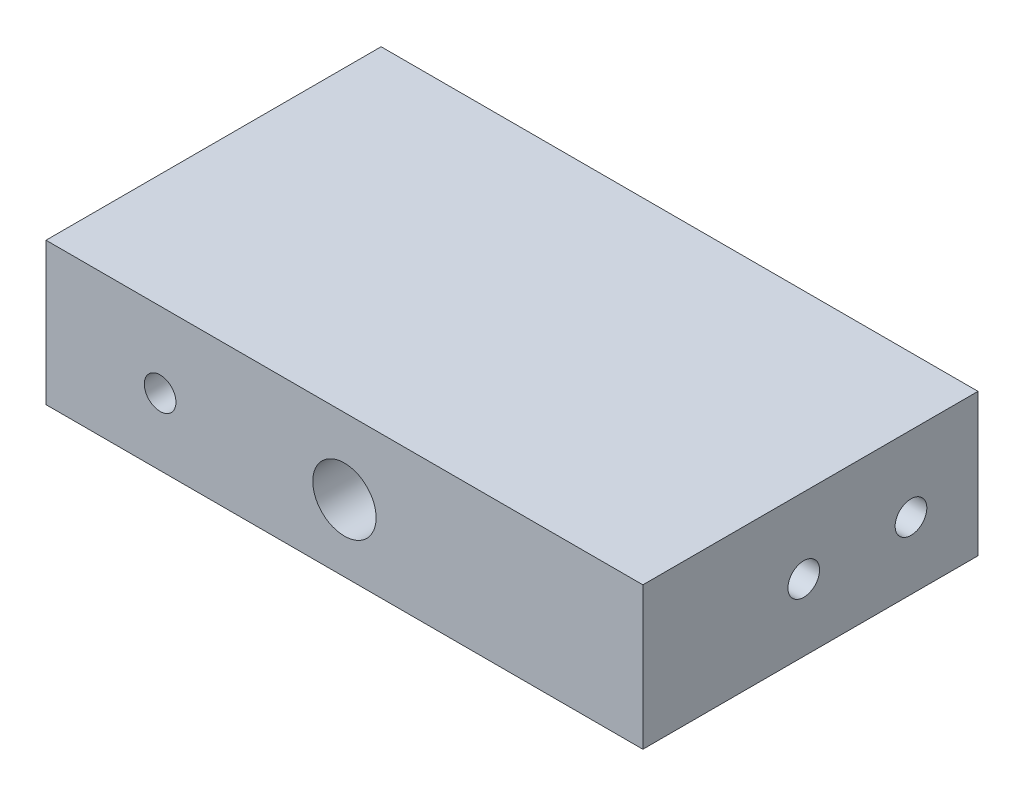
ISO-10303-21;
HEADER;
FILE_DESCRIPTION(('STEP AP214'),'2;1');
FILE_NAME('part.step','',(''),(''),'','','');
FILE_SCHEMA(('AUTOMOTIVE_DESIGN { 1 0 10303 214 1 1 1 1 }'));
ENDSEC;
DATA;
#1=APPLICATION_CONTEXT('core data for automotive mechanical design processes');
#2=APPLICATION_PROTOCOL_DEFINITION('international standard','automotive_design',2000,#1);
#3=PRODUCT_CONTEXT('',#1,'mechanical');
#4=PRODUCT('Part','Part','',(#3));
#5=PRODUCT_RELATED_PRODUCT_CATEGORY('part','',(#4));
#6=PRODUCT_DEFINITION_FORMATION('','',#4);
#7=PRODUCT_DEFINITION_CONTEXT('part definition',#1,'design');
#8=PRODUCT_DEFINITION('design','',#6,#7);
#9=PRODUCT_DEFINITION_SHAPE('','',#8);
#10=(LENGTH_UNIT() NAMED_UNIT(*) SI_UNIT(.MILLI.,.METRE.));
#11=(NAMED_UNIT(*) PLANE_ANGLE_UNIT() SI_UNIT($,.RADIAN.));
#12=(NAMED_UNIT(*) SI_UNIT($,.STERADIAN.) SOLID_ANGLE_UNIT());
#13=UNCERTAINTY_MEASURE_WITH_UNIT(LENGTH_MEASURE(1.E-05),#10,'distance_accuracy_value','');
#14=(GEOMETRIC_REPRESENTATION_CONTEXT(3) GLOBAL_UNCERTAINTY_ASSIGNED_CONTEXT((#13)) GLOBAL_UNIT_ASSIGNED_CONTEXT((#10,
#11,#12)) REPRESENTATION_CONTEXT('',''));
#15=CARTESIAN_POINT('',(0.,0.,0.));
#16=DIRECTION('',(0.,0.,1.));
#17=DIRECTION('',(1.,0.,0.));
#18=AXIS2_PLACEMENT_3D('',#15,#16,#17);
#19=CARTESIAN_POINT('',(-28.275,6.35,31.75));
#20=DIRECTION('',(1.,0.,0.));
#21=DIRECTION('',(0.,0.,-1.));
#22=AXIS2_PLACEMENT_3D('',#19,#20,#21);
#23=PLANE('',#22);
#24=CARTESIAN_POINT('',(-28.275,0.,6.35));
#25=DIRECTION('',(-1.,0.,0.));
#26=DIRECTION('',(0.,0.,1.));
#27=AXIS2_PLACEMENT_3D('',#24,#25,#26);
#28=CIRCLE('',#27,1.5);
#29=CARTESIAN_POINT('',(-28.275,0.,7.85));
#30=VERTEX_POINT('',#29);
#31=EDGE_CURVE('E119',#30,#30,#28,.T.);
#32=ORIENTED_EDGE('',*,*,#31,.F.);
#33=EDGE_LOOP('',(#32));
#34=FACE_BOUND('',#33,.T.);
#35=CARTESIAN_POINT('',(-28.275,0.,16.51));
#36=DIRECTION('',(-1.,0.,0.));
#37=DIRECTION('',(0.,0.,1.));
#38=AXIS2_PLACEMENT_3D('',#35,#36,#37);
#39=CIRCLE('',#38,1.5);
#40=CARTESIAN_POINT('',(-28.275,0.,18.01));
#41=VERTEX_POINT('',#40);
#42=EDGE_CURVE('E114',#41,#41,#39,.T.);
#43=ORIENTED_EDGE('',*,*,#42,.F.);
#44=EDGE_LOOP('',(#43));
#45=FACE_BOUND('',#44,.T.);
#46=DIRECTION('',(0.,-1.,0.));
#47=VECTOR('',#46,1.);
#48=CARTESIAN_POINT('',(-28.275,6.35,0.));
#49=LINE('',#48,#47);
#50=CARTESIAN_POINT('',(-28.275,7.14375,0.));
#51=VERTEX_POINT('',#50);
#52=CARTESIAN_POINT('',(-28.275,-6.35,0.));
#53=VERTEX_POINT('',#52);
#54=EDGE_CURVE('E95',#51,#53,#49,.T.);
#55=ORIENTED_EDGE('',*,*,#54,.T.);
#56=DIRECTION('',(0.,0.,-1.));
#57=VECTOR('',#56,1.);
#58=CARTESIAN_POINT('',(-28.275,-6.35,31.75));
#59=LINE('',#58,#57);
#60=CARTESIAN_POINT('',(-28.275,-6.35,31.75));
#61=VERTEX_POINT('',#60);
#62=EDGE_CURVE('E11',#61,#53,#59,.T.);
#63=ORIENTED_EDGE('',*,*,#62,.F.);
#64=DIRECTION('',(0.,-1.,0.));
#65=VECTOR('',#64,1.);
#66=CARTESIAN_POINT('',(-28.275,6.35,31.75));
#67=LINE('',#66,#65);
#68=CARTESIAN_POINT('',(-28.275,7.14375,31.75));
#69=VERTEX_POINT('',#68);
#70=EDGE_CURVE('E58',#69,#61,#67,.T.);
#71=ORIENTED_EDGE('',*,*,#70,.F.);
#72=DIRECTION('',(0.,0.,1.));
#73=VECTOR('',#72,1.);
#74=CARTESIAN_POINT('',(-28.275,7.14375,0.));
#75=LINE('',#74,#73);
#76=EDGE_CURVE('E99',#51,#69,#75,.T.);
#77=ORIENTED_EDGE('',*,*,#76,.F.);
#78=EDGE_LOOP('',(#55,#63,#71,#77));
#79=FACE_BOUND('',#78,.T.);
#80=ADVANCED_FACE('F41',(#34,#45,#79),#23,.F.);
#81=CARTESIAN_POINT('',(-28.275,-6.35,31.75));
#82=DIRECTION('',(0.,1.,0.));
#83=DIRECTION('',(0.,0.,1.));
#84=AXIS2_PLACEMENT_3D('',#81,#82,#83);
#85=PLANE('',#84);
#86=DIRECTION('',(1.,0.,0.));
#87=VECTOR('',#86,1.);
#88=CARTESIAN_POINT('',(-28.275,-6.35,0.));
#89=LINE('',#88,#87);
#90=CARTESIAN_POINT('',(28.275,-6.35,0.));
#91=VERTEX_POINT('',#90);
#92=EDGE_CURVE('E89',#53,#91,#89,.T.);
#93=ORIENTED_EDGE('',*,*,#92,.T.);
#94=DIRECTION('',(0.,0.,-1.));
#95=VECTOR('',#94,1.);
#96=CARTESIAN_POINT('',(28.275,-6.35,31.75));
#97=LINE('',#96,#95);
#98=CARTESIAN_POINT('',(28.275,-6.35,31.75));
#99=VERTEX_POINT('',#98);
#100=EDGE_CURVE('E45',#99,#91,#97,.T.);
#101=ORIENTED_EDGE('',*,*,#100,.F.);
#102=DIRECTION('',(1.,0.,0.));
#103=VECTOR('',#102,1.);
#104=CARTESIAN_POINT('',(-28.275,-6.35,31.75));
#105=LINE('',#104,#103);
#106=EDGE_CURVE('E138',#61,#99,#105,.T.);
#107=ORIENTED_EDGE('',*,*,#106,.F.);
#108=ORIENTED_EDGE('',*,*,#62,.T.);
#109=EDGE_LOOP('',(#93,#101,#107,#108));
#110=FACE_BOUND('',#109,.T.);
#111=ADVANCED_FACE('F145',(#110),#85,.F.);
#112=CARTESIAN_POINT('',(28.275,6.35,31.75));
#113=DIRECTION('',(1.,0.,0.));
#114=DIRECTION('',(0.,1.,0.));
#115=AXIS2_PLACEMENT_3D('',#112,#113,#114);
#116=PLANE('',#115);
#117=CARTESIAN_POINT('',(28.275,0.,6.35));
#118=DIRECTION('',(-1.,0.,0.));
#119=DIRECTION('',(0.,0.,1.));
#120=AXIS2_PLACEMENT_3D('',#117,#118,#119);
#121=CIRCLE('',#120,1.5);
#122=CARTESIAN_POINT('',(28.275,0.,7.85));
#123=VERTEX_POINT('',#122);
#124=EDGE_CURVE('E106',#123,#123,#121,.T.);
#125=ORIENTED_EDGE('',*,*,#124,.T.);
#126=EDGE_LOOP('',(#125));
#127=FACE_BOUND('',#126,.T.);
#128=CARTESIAN_POINT('',(28.275,0.,16.51));
#129=DIRECTION('',(-1.,0.,0.));
#130=DIRECTION('',(0.,0.,1.));
#131=AXIS2_PLACEMENT_3D('',#128,#129,#130);
#132=CIRCLE('',#131,1.5);
#133=CARTESIAN_POINT('',(28.275,0.,18.01));
#134=VERTEX_POINT('',#133);
#135=EDGE_CURVE('E109',#134,#134,#132,.T.);
#136=ORIENTED_EDGE('',*,*,#135,.T.);
#137=EDGE_LOOP('',(#136));
#138=FACE_BOUND('',#137,.T.);
#139=DIRECTION('',(0.,-1.,0.));
#140=VECTOR('',#139,1.);
#141=CARTESIAN_POINT('',(28.275,6.35,0.));
#142=LINE('',#141,#140);
#143=CARTESIAN_POINT('',(28.275,7.14375,0.));
#144=VERTEX_POINT('',#143);
#145=EDGE_CURVE('E83',#144,#91,#142,.T.);
#146=ORIENTED_EDGE('',*,*,#145,.F.);
#147=DIRECTION('',(0.,0.,-1.));
#148=VECTOR('',#147,1.);
#149=CARTESIAN_POINT('',(28.275,7.14375,31.75));
#150=LINE('',#149,#148);
#151=CARTESIAN_POINT('',(28.275,7.14375,31.75));
#152=VERTEX_POINT('',#151);
#153=EDGE_CURVE('E86',#152,#144,#150,.T.);
#154=ORIENTED_EDGE('',*,*,#153,.F.);
#155=DIRECTION('',(0.,-1.,0.));
#156=VECTOR('',#155,1.);
#157=CARTESIAN_POINT('',(28.275,6.35,31.75));
#158=LINE('',#157,#156);
#159=EDGE_CURVE('E73',#152,#99,#158,.T.);
#160=ORIENTED_EDGE('',*,*,#159,.T.);
#161=ORIENTED_EDGE('',*,*,#100,.T.);
#162=EDGE_LOOP('',(#146,#154,#160,#161));
#163=FACE_BOUND('',#162,.T.);
#164=ADVANCED_FACE('F43',(#127,#138,#163),#116,.T.);
#165=CARTESIAN_POINT('',(0.,0.,31.75));
#166=DIRECTION('',(0.,0.,-1.));
#167=DIRECTION('',(-1.,0.,0.));
#168=AXIS2_PLACEMENT_3D('',#165,#166,#167);
#169=PLANE('',#168);
#170=CARTESIAN_POINT('',(-17.4625,0.,31.75));
#171=DIRECTION('',(0.,0.,1.));
#172=DIRECTION('',(1.,0.,0.));
#173=AXIS2_PLACEMENT_3D('',#170,#171,#172);
#174=CIRCLE('',#173,1.5);
#175=CARTESIAN_POINT('',(-15.9625,0.,31.75));
#176=VERTEX_POINT('',#175);
#177=EDGE_CURVE('E129',#176,#176,#174,.T.);
#178=ORIENTED_EDGE('',*,*,#177,.F.);
#179=EDGE_LOOP('',(#178));
#180=FACE_BOUND('',#179,.T.);
#181=CARTESIAN_POINT('',(0.,0.,31.75));
#182=DIRECTION('',(0.,0.,1.));
#183=DIRECTION('',(1.,0.,0.));
#184=AXIS2_PLACEMENT_3D('',#181,#182,#183);
#185=CIRCLE('',#184,3.);
#186=CARTESIAN_POINT('',(3.,0.,31.75));
#187=VERTEX_POINT('',#186);
#188=EDGE_CURVE('E118',#187,#187,#185,.T.);
#189=ORIENTED_EDGE('',*,*,#188,.F.);
#190=EDGE_LOOP('',(#189));
#191=FACE_BOUND('',#190,.T.);
#192=ORIENTED_EDGE('',*,*,#159,.F.);
#193=DIRECTION('',(1.,0.,0.));
#194=VECTOR('',#193,1.);
#195=CARTESIAN_POINT('',(-28.275,7.14375,31.75));
#196=LINE('',#195,#194);
#197=EDGE_CURVE('E102',#69,#152,#196,.T.);
#198=ORIENTED_EDGE('',*,*,#197,.F.);
#199=ORIENTED_EDGE('',*,*,#70,.T.);
#200=ORIENTED_EDGE('',*,*,#106,.T.);
#201=EDGE_LOOP('',(#192,#198,#199,#200));
#202=FACE_BOUND('',#201,.T.);
#203=ADVANCED_FACE('F146',(#180,#191,#202),#169,.F.);
#204=CARTESIAN_POINT('',(0.,0.,0.));
#205=DIRECTION('',(0.,0.,-1.));
#206=DIRECTION('',(-1.,0.,0.));
#207=AXIS2_PLACEMENT_3D('',#204,#205,#206);
#208=PLANE('',#207);
#209=ORIENTED_EDGE('',*,*,#54,.F.);
#210=DIRECTION('',(-1.,0.,0.));
#211=VECTOR('',#210,1.);
#212=CARTESIAN_POINT('',(28.275,7.14375,0.));
#213=LINE('',#212,#211);
#214=EDGE_CURVE('E93',#144,#51,#213,.T.);
#215=ORIENTED_EDGE('',*,*,#214,.F.);
#216=ORIENTED_EDGE('',*,*,#145,.T.);
#217=ORIENTED_EDGE('',*,*,#92,.F.);
#218=EDGE_LOOP('',(#209,#215,#216,#217));
#219=FACE_BOUND('',#218,.T.);
#220=ADVANCED_FACE('F94',(#219),#208,.T.);
#221=CARTESIAN_POINT('',(0.,0.,21.75));
#222=DIRECTION('',(0.,0.,1.));
#223=DIRECTION('',(1.,0.,0.));
#224=AXIS2_PLACEMENT_3D('',#221,#222,#223);
#225=CYLINDRICAL_SURFACE('',#224,3.);
#226=CARTESIAN_POINT('',(0.,0.,21.75));
#227=DIRECTION('',(0.,0.,1.));
#228=DIRECTION('',(1.,0.,0.));
#229=AXIS2_PLACEMENT_3D('',#226,#227,#228);
#230=CIRCLE('',#229,3.);
#231=CARTESIAN_POINT('',(3.,0.,21.75));
#232=VERTEX_POINT('',#231);
#233=EDGE_CURVE('E132',#232,#232,#230,.T.);
#234=ORIENTED_EDGE('',*,*,#233,.F.);
#235=EDGE_LOOP('',(#234));
#236=FACE_BOUND('',#235,.T.);
#237=ORIENTED_EDGE('',*,*,#188,.T.);
#238=EDGE_LOOP('',(#237));
#239=FACE_BOUND('',#238,.T.);
#240=ADVANCED_FACE('F154',(#236,#239),#225,.F.);
#241=CARTESIAN_POINT('',(0.,0.,21.75));
#242=DIRECTION('',(0.,0.,1.));
#243=DIRECTION('',(1.,0.,0.));
#244=AXIS2_PLACEMENT_3D('',#241,#242,#243);
#245=PLANE('',#244);
#246=ORIENTED_EDGE('',*,*,#233,.T.);
#247=EDGE_LOOP('',(#246));
#248=FACE_BOUND('',#247,.T.);
#249=ADVANCED_FACE('F192',(#248),#245,.T.);
#250=CARTESIAN_POINT('',(-17.4625,0.,21.75));
#251=DIRECTION('',(0.,0.,1.));
#252=DIRECTION('',(1.,0.,0.));
#253=AXIS2_PLACEMENT_3D('',#250,#251,#252);
#254=CYLINDRICAL_SURFACE('',#253,1.5);
#255=CARTESIAN_POINT('',(-17.4625,0.,21.75));
#256=DIRECTION('',(0.,0.,1.));
#257=DIRECTION('',(1.,0.,0.));
#258=AXIS2_PLACEMENT_3D('',#255,#256,#257);
#259=CIRCLE('',#258,1.5);
#260=CARTESIAN_POINT('',(-15.9625,0.,21.75));
#261=VERTEX_POINT('',#260);
#262=EDGE_CURVE('E90',#261,#261,#259,.T.);
#263=ORIENTED_EDGE('',*,*,#262,.F.);
#264=EDGE_LOOP('',(#263));
#265=FACE_BOUND('',#264,.T.);
#266=ORIENTED_EDGE('',*,*,#177,.T.);
#267=EDGE_LOOP('',(#266));
#268=FACE_BOUND('',#267,.T.);
#269=ADVANCED_FACE('F184',(#265,#268),#254,.F.);
#270=CARTESIAN_POINT('',(0.,0.,21.75));
#271=DIRECTION('',(0.,0.,1.));
#272=DIRECTION('',(1.,0.,0.));
#273=AXIS2_PLACEMENT_3D('',#270,#271,#272);
#274=PLANE('',#273);
#275=ORIENTED_EDGE('',*,*,#262,.T.);
#276=EDGE_LOOP('',(#275));
#277=FACE_BOUND('',#276,.T.);
#278=ADVANCED_FACE('F174',(#277),#274,.T.);
#279=CARTESIAN_POINT('',(-20.275,0.,16.51));
#280=DIRECTION('',(-1.,0.,0.));
#281=DIRECTION('',(0.,0.,1.));
#282=AXIS2_PLACEMENT_3D('',#279,#280,#281);
#283=CYLINDRICAL_SURFACE('',#282,1.5);
#284=CARTESIAN_POINT('',(-20.275,0.,16.51));
#285=DIRECTION('',(-1.,0.,0.));
#286=DIRECTION('',(0.,0.,1.));
#287=AXIS2_PLACEMENT_3D('',#284,#285,#286);
#288=CIRCLE('',#287,1.5);
#289=CARTESIAN_POINT('',(-20.275,0.,18.01));
#290=VERTEX_POINT('',#289);
#291=EDGE_CURVE('E122',#290,#290,#288,.T.);
#292=ORIENTED_EDGE('',*,*,#291,.F.);
#293=EDGE_LOOP('',(#292));
#294=FACE_BOUND('',#293,.T.);
#295=ORIENTED_EDGE('',*,*,#42,.T.);
#296=EDGE_LOOP('',(#295));
#297=FACE_BOUND('',#296,.T.);
#298=ADVANCED_FACE('F171',(#294,#297),#283,.F.);
#299=CARTESIAN_POINT('',(-20.275,0.,0.));
#300=DIRECTION('',(-1.,0.,0.));
#301=DIRECTION('',(0.,0.,1.));
#302=AXIS2_PLACEMENT_3D('',#299,#300,#301);
#303=PLANE('',#302);
#304=ORIENTED_EDGE('',*,*,#291,.T.);
#305=EDGE_LOOP('',(#304));
#306=FACE_BOUND('',#305,.T.);
#307=ADVANCED_FACE('F173',(#306),#303,.T.);
#308=CARTESIAN_POINT('',(-20.275,0.,6.35));
#309=DIRECTION('',(-1.,0.,0.));
#310=DIRECTION('',(0.,0.,1.));
#311=AXIS2_PLACEMENT_3D('',#308,#309,#310);
#312=CYLINDRICAL_SURFACE('',#311,1.5);
#313=CARTESIAN_POINT('',(-20.275,0.,6.35));
#314=DIRECTION('',(-1.,0.,0.));
#315=DIRECTION('',(0.,0.,1.));
#316=AXIS2_PLACEMENT_3D('',#313,#314,#315);
#317=CIRCLE('',#316,1.5);
#318=CARTESIAN_POINT('',(-20.275,0.,7.85));
#319=VERTEX_POINT('',#318);
#320=EDGE_CURVE('E115',#319,#319,#317,.T.);
#321=ORIENTED_EDGE('',*,*,#320,.F.);
#322=EDGE_LOOP('',(#321));
#323=FACE_BOUND('',#322,.T.);
#324=ORIENTED_EDGE('',*,*,#31,.T.);
#325=EDGE_LOOP('',(#324));
#326=FACE_BOUND('',#325,.T.);
#327=ADVANCED_FACE('F181',(#323,#326),#312,.F.);
#328=CARTESIAN_POINT('',(-20.275,0.,0.));
#329=DIRECTION('',(-1.,0.,0.));
#330=DIRECTION('',(0.,0.,1.));
#331=AXIS2_PLACEMENT_3D('',#328,#329,#330);
#332=PLANE('',#331);
#333=ORIENTED_EDGE('',*,*,#320,.T.);
#334=EDGE_LOOP('',(#333));
#335=FACE_BOUND('',#334,.T.);
#336=ADVANCED_FACE('F246',(#335),#332,.T.);
#337=CARTESIAN_POINT('',(0.,7.14375,0.));
#338=DIRECTION('',(0.,1.,0.));
#339=DIRECTION('',(0.,0.,1.));
#340=AXIS2_PLACEMENT_3D('',#337,#338,#339);
#341=PLANE('',#340);
#342=ORIENTED_EDGE('',*,*,#153,.T.);
#343=ORIENTED_EDGE('',*,*,#214,.T.);
#344=ORIENTED_EDGE('',*,*,#76,.T.);
#345=ORIENTED_EDGE('',*,*,#197,.T.);
#346=EDGE_LOOP('',(#342,#343,#344,#345));
#347=FACE_BOUND('',#346,.T.);
#348=ADVANCED_FACE('F101',(#347),#341,.T.);
#349=CARTESIAN_POINT('',(20.275,0.,16.51));
#350=DIRECTION('',(1.,0.,0.));
#351=DIRECTION('',(0.,0.,-1.));
#352=AXIS2_PLACEMENT_3D('',#349,#350,#351);
#353=CYLINDRICAL_SURFACE('',#352,1.5);
#354=CARTESIAN_POINT('',(20.275,0.,16.51));
#355=DIRECTION('',(-1.,0.,0.));
#356=DIRECTION('',(0.,0.,1.));
#357=AXIS2_PLACEMENT_3D('',#354,#355,#356);
#358=CIRCLE('',#357,1.5);
#359=CARTESIAN_POINT('',(20.275,0.,18.01));
#360=VERTEX_POINT('',#359);
#361=EDGE_CURVE('E345',#360,#360,#358,.T.);
#362=ORIENTED_EDGE('',*,*,#361,.T.);
#363=EDGE_LOOP('',(#362));
#364=FACE_BOUND('',#363,.T.);
#365=ORIENTED_EDGE('',*,*,#135,.F.);
#366=EDGE_LOOP('',(#365));
#367=FACE_BOUND('',#366,.T.);
#368=ADVANCED_FACE('F294',(#364,#367),#353,.F.);
#369=CARTESIAN_POINT('',(20.275,0.,0.));
#370=DIRECTION('',(1.,0.,0.));
#371=DIRECTION('',(0.,0.,1.));
#372=AXIS2_PLACEMENT_3D('',#369,#370,#371);
#373=PLANE('',#372);
#374=ORIENTED_EDGE('',*,*,#361,.F.);
#375=EDGE_LOOP('',(#374));
#376=FACE_BOUND('',#375,.T.);
#377=ADVANCED_FACE('F302',(#376),#373,.T.);
#378=CARTESIAN_POINT('',(20.275,0.,6.35));
#379=DIRECTION('',(1.,0.,0.));
#380=DIRECTION('',(0.,0.,-1.));
#381=AXIS2_PLACEMENT_3D('',#378,#379,#380);
#382=CYLINDRICAL_SURFACE('',#381,1.5);
#383=CARTESIAN_POINT('',(20.275,0.,6.35));
#384=DIRECTION('',(-1.,0.,0.));
#385=DIRECTION('',(0.,0.,1.));
#386=AXIS2_PLACEMENT_3D('',#383,#384,#385);
#387=CIRCLE('',#386,1.5);
#388=CARTESIAN_POINT('',(20.275,0.,7.85));
#389=VERTEX_POINT('',#388);
#390=EDGE_CURVE('E103',#389,#389,#387,.T.);
#391=ORIENTED_EDGE('',*,*,#390,.T.);
#392=EDGE_LOOP('',(#391));
#393=FACE_BOUND('',#392,.T.);
#394=ORIENTED_EDGE('',*,*,#124,.F.);
#395=EDGE_LOOP('',(#394));
#396=FACE_BOUND('',#395,.T.);
#397=ADVANCED_FACE('F312',(#393,#396),#382,.F.);
#398=CARTESIAN_POINT('',(20.275,0.,0.));
#399=DIRECTION('',(1.,0.,0.));
#400=DIRECTION('',(0.,0.,1.));
#401=AXIS2_PLACEMENT_3D('',#398,#399,#400);
#402=PLANE('',#401);
#403=ORIENTED_EDGE('',*,*,#390,.F.);
#404=EDGE_LOOP('',(#403));
#405=FACE_BOUND('',#404,.T.);
#406=ADVANCED_FACE('F325',(#405),#402,.T.);
#407=CLOSED_SHELL('',(#80,#111,#164,#203,#220,#240,#249,#269,#278,#298,#307,#327,#336,#348,#368,
#377,#397,#406));
#408=MANIFOLD_SOLID_BREP('B2',#407);
#409=ADVANCED_BREP_SHAPE_REPRESENTATION('',(#18,#408),#14);
#410=SHAPE_DEFINITION_REPRESENTATION(#9,#409);
ENDSEC;
END-ISO-10303-21;
